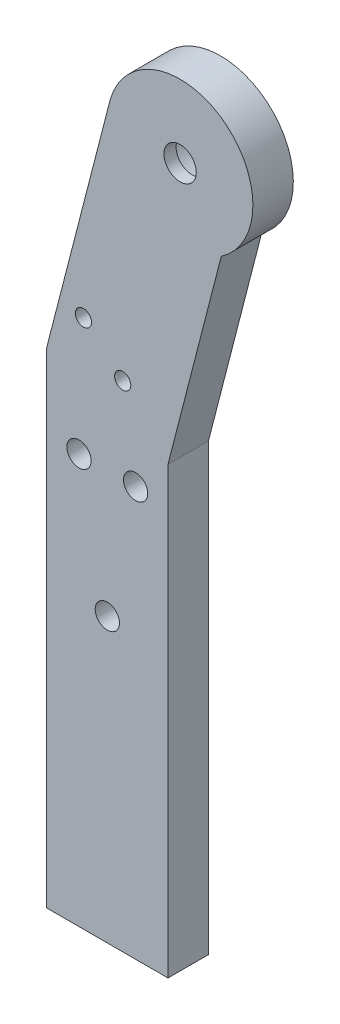
ISO-10303-21;
HEADER;
FILE_DESCRIPTION(('STEP AP214'),'2;1');
FILE_NAME('part.step','',(''),(''),'','','');
FILE_SCHEMA(('AUTOMOTIVE_DESIGN { 1 0 10303 214 1 1 1 1 }'));
ENDSEC;
DATA;
#1=APPLICATION_CONTEXT('core data for automotive mechanical design processes');
#2=APPLICATION_PROTOCOL_DEFINITION('international standard','automotive_design',2000,#1);
#3=PRODUCT_CONTEXT('',#1,'mechanical');
#4=PRODUCT('Part','Part','',(#3));
#5=PRODUCT_RELATED_PRODUCT_CATEGORY('part','',(#4));
#6=PRODUCT_DEFINITION_FORMATION('','',#4);
#7=PRODUCT_DEFINITION_CONTEXT('part definition',#1,'design');
#8=PRODUCT_DEFINITION('design','',#6,#7);
#9=PRODUCT_DEFINITION_SHAPE('','',#8);
#10=(LENGTH_UNIT() NAMED_UNIT(*) SI_UNIT(.MILLI.,.METRE.));
#11=(NAMED_UNIT(*) PLANE_ANGLE_UNIT() SI_UNIT($,.RADIAN.));
#12=(NAMED_UNIT(*) SI_UNIT($,.STERADIAN.) SOLID_ANGLE_UNIT());
#13=UNCERTAINTY_MEASURE_WITH_UNIT(LENGTH_MEASURE(1.E-05),#10,'distance_accuracy_value','');
#14=(GEOMETRIC_REPRESENTATION_CONTEXT(3) GLOBAL_UNCERTAINTY_ASSIGNED_CONTEXT((#13)) GLOBAL_UNIT_ASSIGNED_CONTEXT((#10,
#11,#12)) REPRESENTATION_CONTEXT('',''));
#15=CARTESIAN_POINT('',(0.,0.,0.));
#16=DIRECTION('',(0.,0.,1.));
#17=DIRECTION('',(1.,0.,0.));
#18=AXIS2_PLACEMENT_3D('',#15,#16,#17);
#19=CARTESIAN_POINT('',(10.1625447345755,96.8922983540658,5.));
#20=DIRECTION('',(0.,0.,-1.));
#21=DIRECTION('',(-1.,0.,0.));
#22=AXIS2_PLACEMENT_3D('',#19,#20,#21);
#23=CYLINDRICAL_SURFACE('',#22,2.);
#24=CARTESIAN_POINT('',(10.1625447345755,96.8922983540658,5.));
#25=DIRECTION('',(0.,0.,1.));
#26=DIRECTION('',(1.,0.,0.));
#27=AXIS2_PLACEMENT_3D('',#24,#25,#26);
#28=CIRCLE('',#27,2.);
#29=CARTESIAN_POINT('',(12.1625447345755,96.8922983540658,5.));
#30=VERTEX_POINT('',#29);
#31=EDGE_CURVE('E130',#30,#30,#28,.T.);
#32=ORIENTED_EDGE('',*,*,#31,.T.);
#33=EDGE_LOOP('',(#32));
#34=FACE_BOUND('',#33,.T.);
#35=CARTESIAN_POINT('',(10.1625447345755,96.8922983540658,3.5));
#36=DIRECTION('',(0.,0.,-1.));
#37=DIRECTION('',(-1.,0.,0.));
#38=AXIS2_PLACEMENT_3D('',#35,#36,#37);
#39=CIRCLE('',#38,2.);
#40=CARTESIAN_POINT('',(8.16254473457546,96.8922983540658,3.5));
#41=VERTEX_POINT('',#40);
#42=EDGE_CURVE('E43',#41,#41,#39,.T.);
#43=ORIENTED_EDGE('',*,*,#42,.T.);
#44=EDGE_LOOP('',(#43));
#45=FACE_BOUND('',#44,.T.);
#46=ADVANCED_FACE('F39',(#34,#45),#23,.F.);
#47=CARTESIAN_POINT('',(10.1625447345755,96.8922983540658,5.));
#48=DIRECTION('',(0.,0.,-1.));
#49=DIRECTION('',(-1.,0.,0.));
#50=AXIS2_PLACEMENT_3D('',#47,#48,#49);
#51=PLANE('',#50);
#52=CARTESIAN_POINT('',(-2.33745510636055,59.512300154388,5.));
#53=DIRECTION('',(0.,0.,-1.));
#54=DIRECTION('',(-1.,0.,0.));
#55=AXIS2_PLACEMENT_3D('',#52,#53,#54);
#56=CIRCLE('',#55,1.49999999246271);
#57=CARTESIAN_POINT('',(-3.83745509882326,59.512300154388,5.));
#58=VERTEX_POINT('',#57);
#59=EDGE_CURVE('E257',#58,#58,#56,.T.);
#60=ORIENTED_EDGE('',*,*,#59,.T.);
#61=EDGE_LOOP('',(#60));
#62=FACE_BOUND('',#61,.T.);
#63=CARTESIAN_POINT('',(4.66254492186838,59.512300154388,5.));
#64=DIRECTION('',(0.,0.,-1.));
#65=DIRECTION('',(-1.,0.,0.));
#66=AXIS2_PLACEMENT_3D('',#63,#64,#65);
#67=CIRCLE('',#66,1.49999999246272);
#68=CARTESIAN_POINT('',(3.16254492940565,59.512300154388,5.));
#69=VERTEX_POINT('',#68);
#70=EDGE_CURVE('E260',#69,#69,#67,.T.);
#71=ORIENTED_EDGE('',*,*,#70,.T.);
#72=EDGE_LOOP('',(#71));
#73=FACE_BOUND('',#72,.T.);
#74=CARTESIAN_POINT('',(3.0635978829444,70.0457948561483,5.));
#75=DIRECTION('',(0.,0.,-1.));
#76=DIRECTION('',(-1.,0.,0.));
#77=AXIS2_PLACEMENT_3D('',#74,#75,#76);
#78=CIRCLE('',#77,1.);
#79=CARTESIAN_POINT('',(2.0635978829444,70.0457948561483,5.));
#80=VERTEX_POINT('',#79);
#81=EDGE_CURVE('E205',#80,#80,#78,.T.);
#82=ORIENTED_EDGE('',*,*,#81,.T.);
#83=EDGE_LOOP('',(#82));
#84=FACE_BOUND('',#83,.T.);
#85=CARTESIAN_POINT('',(-1.79494681524586,74.3637276272423,5.));
#86=DIRECTION('',(0.,0.,-1.));
#87=DIRECTION('',(-1.,0.,0.));
#88=AXIS2_PLACEMENT_3D('',#85,#86,#87);
#89=CIRCLE('',#88,1.);
#90=CARTESIAN_POINT('',(-2.79494681524586,74.3637276272423,5.));
#91=VERTEX_POINT('',#90);
#92=EDGE_CURVE('E210',#91,#91,#89,.T.);
#93=ORIENTED_EDGE('',*,*,#92,.T.);
#94=EDGE_LOOP('',(#93));
#95=FACE_BOUND('',#94,.T.);
#96=DIRECTION('',(1.,0.,0.));
#97=VECTOR('',#96,1.);
#98=CARTESIAN_POINT('',(8.66254473457549,8.89229835406582,5.));
#99=LINE('',#98,#97);
#100=CARTESIAN_POINT('',(-6.33745526542453,8.89229835406581,5.));
#101=VERTEX_POINT('',#100);
#102=CARTESIAN_POINT('',(8.66254473457549,8.89229835406582,5.));
#103=VERTEX_POINT('',#102);
#104=EDGE_CURVE('E137',#101,#103,#99,.T.);
#105=ORIENTED_EDGE('',*,*,#104,.T.);
#106=DIRECTION('',(0.,1.,0.));
#107=VECTOR('',#106,1.);
#108=CARTESIAN_POINT('',(8.66254473457547,63.8922983540658,5.));
#109=LINE('',#108,#107);
#110=CARTESIAN_POINT('',(8.66254473457547,63.8922983540658,5.));
#111=VERTEX_POINT('',#110);
#112=EDGE_CURVE('E94',#103,#111,#109,.T.);
#113=ORIENTED_EDGE('',*,*,#112,.T.);
#114=DIRECTION('',(0.24953507523535,0.968365760561209,0.));
#115=VECTOR('',#114,1.);
#116=CARTESIAN_POINT('',(8.66254473457547,63.8922983540658,5.));
#117=LINE('',#116,#115);
#118=CARTESIAN_POINT('',(15.2537740476357,89.4707497230969,5.));
#119=VERTEX_POINT('',#118);
#120=EDGE_CURVE('E108',#111,#119,#117,.T.);
#121=ORIENTED_EDGE('',*,*,#120,.T.);
#122=CARTESIAN_POINT('',(10.1625447345755,96.8922983540658,5.));
#123=DIRECTION('',(0.,0.,1.));
#124=DIRECTION('',(-1.,0.,0.));
#125=AXIS2_PLACEMENT_3D('',#122,#123,#124);
#126=CIRCLE('',#125,9.);
#127=CARTESIAN_POINT('',(1.55603210918578,99.5243964580521,5.));
#128=VERTEX_POINT('',#127);
#129=EDGE_CURVE('E101',#119,#128,#126,.T.);
#130=ORIENTED_EDGE('',*,*,#129,.T.);
#131=DIRECTION('',(-0.24953507523535,-0.968365760561209,0.));
#132=VECTOR('',#131,1.);
#133=CARTESIAN_POINT('',(-6.33745526542453,68.8922983540658,5.));
#134=LINE('',#133,#132);
#135=CARTESIAN_POINT('',(-6.33745526542453,68.8922983540658,5.));
#136=VERTEX_POINT('',#135);
#137=EDGE_CURVE('E106',#128,#136,#134,.T.);
#138=ORIENTED_EDGE('',*,*,#137,.T.);
#139=DIRECTION('',(0.,-1.,0.));
#140=VECTOR('',#139,1.);
#141=CARTESIAN_POINT('',(-6.33745526542453,8.89229835406581,5.));
#142=LINE('',#141,#140);
#143=EDGE_CURVE('E57',#136,#101,#142,.T.);
#144=ORIENTED_EDGE('',*,*,#143,.T.);
#145=EDGE_LOOP('',(#105,#113,#121,#130,#138,#144));
#146=FACE_BOUND('',#145,.T.);
#147=ORIENTED_EDGE('',*,*,#31,.F.);
#148=EDGE_LOOP('',(#147));
#149=FACE_BOUND('',#148,.T.);
#150=CARTESIAN_POINT('',(1.16254473457547,43.8922983540658,5.));
#151=DIRECTION('',(0.,0.,1.));
#152=DIRECTION('',(1.,0.,0.));
#153=AXIS2_PLACEMENT_3D('',#150,#151,#152);
#154=CIRCLE('',#153,1.5);
#155=CARTESIAN_POINT('',(2.66254473457547,43.8922983540658,5.));
#156=VERTEX_POINT('',#155);
#157=EDGE_CURVE('E213',#156,#156,#154,.T.);
#158=ORIENTED_EDGE('',*,*,#157,.F.);
#159=EDGE_LOOP('',(#158));
#160=FACE_BOUND('',#159,.T.);
#161=ADVANCED_FACE('F103',(#62,#73,#84,#95,#146,#149,#160),#51,.F.);
#162=CARTESIAN_POINT('',(10.1625447345755,96.8922983540658,0.));
#163=DIRECTION('',(0.,0.,-1.));
#164=DIRECTION('',(-1.,0.,0.));
#165=AXIS2_PLACEMENT_3D('',#162,#163,#164);
#166=PLANE('',#165);
#167=CARTESIAN_POINT('',(-2.33745510636055,59.512300154388,0.));
#168=DIRECTION('',(0.,0.,-1.));
#169=DIRECTION('',(-1.,0.,0.));
#170=AXIS2_PLACEMENT_3D('',#167,#168,#169);
#171=CIRCLE('',#170,1.49999999246271);
#172=CARTESIAN_POINT('',(-3.83745509882326,59.512300154388,0.));
#173=VERTEX_POINT('',#172);
#174=EDGE_CURVE('E187',#173,#173,#171,.T.);
#175=ORIENTED_EDGE('',*,*,#174,.F.);
#176=EDGE_LOOP('',(#175));
#177=FACE_BOUND('',#176,.T.);
#178=CARTESIAN_POINT('',(4.66254492186838,59.512300154388,0.));
#179=DIRECTION('',(0.,0.,-1.));
#180=DIRECTION('',(-1.,0.,0.));
#181=AXIS2_PLACEMENT_3D('',#178,#179,#180);
#182=CIRCLE('',#181,1.49999999246272);
#183=CARTESIAN_POINT('',(3.16254492940565,59.512300154388,0.));
#184=VERTEX_POINT('',#183);
#185=EDGE_CURVE('E191',#184,#184,#182,.T.);
#186=ORIENTED_EDGE('',*,*,#185,.F.);
#187=EDGE_LOOP('',(#186));
#188=FACE_BOUND('',#187,.T.);
#189=CARTESIAN_POINT('',(3.0635978829444,70.0457948561483,0.));
#190=DIRECTION('',(0.,0.,-1.));
#191=DIRECTION('',(-1.,0.,0.));
#192=AXIS2_PLACEMENT_3D('',#189,#190,#191);
#193=CIRCLE('',#192,1.);
#194=CARTESIAN_POINT('',(2.0635978829444,70.0457948561483,0.));
#195=VERTEX_POINT('',#194);
#196=EDGE_CURVE('E195',#195,#195,#193,.T.);
#197=ORIENTED_EDGE('',*,*,#196,.F.);
#198=EDGE_LOOP('',(#197));
#199=FACE_BOUND('',#198,.T.);
#200=CARTESIAN_POINT('',(-1.79494681524586,74.3637276272423,0.));
#201=DIRECTION('',(0.,0.,-1.));
#202=DIRECTION('',(-1.,0.,0.));
#203=AXIS2_PLACEMENT_3D('',#200,#201,#202);
#204=CIRCLE('',#203,1.);
#205=CARTESIAN_POINT('',(-2.79494681524586,74.3637276272423,0.));
#206=VERTEX_POINT('',#205);
#207=EDGE_CURVE('E199',#206,#206,#204,.T.);
#208=ORIENTED_EDGE('',*,*,#207,.F.);
#209=EDGE_LOOP('',(#208));
#210=FACE_BOUND('',#209,.T.);
#211=CARTESIAN_POINT('',(10.1625447345755,96.8922983540658,0.));
#212=DIRECTION('',(0.,0.,-1.));
#213=DIRECTION('',(-1.,0.,0.));
#214=AXIS2_PLACEMENT_3D('',#211,#212,#213);
#215=CIRCLE('',#214,4.5);
#216=CARTESIAN_POINT('',(5.66254473457546,96.8922983540658,0.));
#217=VERTEX_POINT('',#216);
#218=EDGE_CURVE('E202',#217,#217,#215,.T.);
#219=ORIENTED_EDGE('',*,*,#218,.F.);
#220=EDGE_LOOP('',(#219));
#221=FACE_BOUND('',#220,.T.);
#222=DIRECTION('',(1.,0.,0.));
#223=VECTOR('',#222,1.);
#224=CARTESIAN_POINT('',(8.66254473457549,8.89229835406582,0.));
#225=LINE('',#224,#223);
#226=CARTESIAN_POINT('',(-6.33745526542453,8.89229835406581,0.));
#227=VERTEX_POINT('',#226);
#228=CARTESIAN_POINT('',(8.66254473457549,8.89229835406582,0.));
#229=VERTEX_POINT('',#228);
#230=EDGE_CURVE('E126',#227,#229,#225,.T.);
#231=ORIENTED_EDGE('',*,*,#230,.F.);
#232=DIRECTION('',(0.,-1.,0.));
#233=VECTOR('',#232,1.);
#234=CARTESIAN_POINT('',(-6.33745526542453,8.89229835406581,0.));
#235=LINE('',#234,#233);
#236=CARTESIAN_POINT('',(-6.33745526542453,68.8922983540658,0.));
#237=VERTEX_POINT('',#236);
#238=EDGE_CURVE('E86',#237,#227,#235,.T.);
#239=ORIENTED_EDGE('',*,*,#238,.F.);
#240=DIRECTION('',(-0.24953507523535,-0.968365760561209,0.));
#241=VECTOR('',#240,1.);
#242=CARTESIAN_POINT('',(-6.33745526542453,68.8922983540658,0.));
#243=LINE('',#242,#241);
#244=CARTESIAN_POINT('',(1.55603210918578,99.5243964580521,0.));
#245=VERTEX_POINT('',#244);
#246=EDGE_CURVE('E80',#245,#237,#243,.T.);
#247=ORIENTED_EDGE('',*,*,#246,.F.);
#248=CARTESIAN_POINT('',(10.1625447345755,96.8922983540658,0.));
#249=DIRECTION('',(0.,0.,1.));
#250=DIRECTION('',(-1.,0.,0.));
#251=AXIS2_PLACEMENT_3D('',#248,#249,#250);
#252=CIRCLE('',#251,9.);
#253=CARTESIAN_POINT('',(15.2537740476357,89.4707497230969,0.));
#254=VERTEX_POINT('',#253);
#255=EDGE_CURVE('E116',#254,#245,#252,.T.);
#256=ORIENTED_EDGE('',*,*,#255,.F.);
#257=DIRECTION('',(0.24953507523535,0.968365760561209,0.));
#258=VECTOR('',#257,1.);
#259=CARTESIAN_POINT('',(8.66254473457547,63.8922983540658,0.));
#260=LINE('',#259,#258);
#261=CARTESIAN_POINT('',(8.66254473457547,63.8922983540658,0.));
#262=VERTEX_POINT('',#261);
#263=EDGE_CURVE('E132',#262,#254,#260,.T.);
#264=ORIENTED_EDGE('',*,*,#263,.F.);
#265=DIRECTION('',(0.,1.,0.));
#266=VECTOR('',#265,1.);
#267=CARTESIAN_POINT('',(8.66254473457547,63.8922983540658,0.));
#268=LINE('',#267,#266);
#269=EDGE_CURVE('E129',#229,#262,#268,.T.);
#270=ORIENTED_EDGE('',*,*,#269,.F.);
#271=EDGE_LOOP('',(#231,#239,#247,#256,#264,#270));
#272=FACE_BOUND('',#271,.T.);
#273=CARTESIAN_POINT('',(1.16254473457547,43.8922983540658,0.));
#274=DIRECTION('',(0.,0.,1.));
#275=DIRECTION('',(1.,0.,0.));
#276=AXIS2_PLACEMENT_3D('',#273,#274,#275);
#277=CIRCLE('',#276,1.5);
#278=CARTESIAN_POINT('',(2.66254473457547,43.8922983540658,0.));
#279=VERTEX_POINT('',#278);
#280=EDGE_CURVE('E216',#279,#279,#277,.T.);
#281=ORIENTED_EDGE('',*,*,#280,.T.);
#282=EDGE_LOOP('',(#281));
#283=FACE_BOUND('',#282,.T.);
#284=ADVANCED_FACE('F147',(#177,#188,#199,#210,#221,#272,#283),#166,.T.);
#285=CARTESIAN_POINT('',(8.66254473457549,8.89229835406582,5.));
#286=DIRECTION('',(0.,1.,0.));
#287=DIRECTION('',(-1.,0.,0.));
#288=AXIS2_PLACEMENT_3D('',#285,#286,#287);
#289=PLANE('',#288);
#290=ORIENTED_EDGE('',*,*,#230,.T.);
#291=DIRECTION('',(0.,0.,-1.));
#292=VECTOR('',#291,1.);
#293=CARTESIAN_POINT('',(8.66254473457549,8.89229835406582,5.));
#294=LINE('',#293,#292);
#295=EDGE_CURVE('E11',#103,#229,#294,.T.);
#296=ORIENTED_EDGE('',*,*,#295,.F.);
#297=ORIENTED_EDGE('',*,*,#104,.F.);
#298=DIRECTION('',(0.,0.,-1.));
#299=VECTOR('',#298,1.);
#300=CARTESIAN_POINT('',(-6.33745526542453,8.89229835406581,5.));
#301=LINE('',#300,#299);
#302=EDGE_CURVE('E122',#101,#227,#301,.T.);
#303=ORIENTED_EDGE('',*,*,#302,.T.);
#304=EDGE_LOOP('',(#290,#296,#297,#303));
#305=FACE_BOUND('',#304,.T.);
#306=ADVANCED_FACE('F41',(#305),#289,.F.);
#307=CARTESIAN_POINT('',(8.66254473457547,63.8922983540658,5.));
#308=DIRECTION('',(-1.,0.,0.));
#309=DIRECTION('',(0.,-1.,0.));
#310=AXIS2_PLACEMENT_3D('',#307,#308,#309);
#311=PLANE('',#310);
#312=ORIENTED_EDGE('',*,*,#269,.T.);
#313=DIRECTION('',(0.,0.,-1.));
#314=VECTOR('',#313,1.);
#315=CARTESIAN_POINT('',(8.66254473457547,63.8922983540658,5.));
#316=LINE('',#315,#314);
#317=EDGE_CURVE('E49',#111,#262,#316,.T.);
#318=ORIENTED_EDGE('',*,*,#317,.F.);
#319=ORIENTED_EDGE('',*,*,#112,.F.);
#320=ORIENTED_EDGE('',*,*,#295,.T.);
#321=EDGE_LOOP('',(#312,#318,#319,#320));
#322=FACE_BOUND('',#321,.T.);
#323=ADVANCED_FACE('F183',(#322),#311,.F.);
#324=CARTESIAN_POINT('',(8.66254473457547,63.8922983540658,5.));
#325=DIRECTION('',(-0.968365760561209,0.24953507523535,0.));
#326=DIRECTION('',(-0.24953507523535,-0.968365760561209,0.));
#327=AXIS2_PLACEMENT_3D('',#324,#325,#326);
#328=PLANE('',#327);
#329=ORIENTED_EDGE('',*,*,#263,.T.);
#330=DIRECTION('',(0.,0.,-1.));
#331=VECTOR('',#330,1.);
#332=CARTESIAN_POINT('',(15.2537740476357,89.4707497230969,5.));
#333=LINE('',#332,#331);
#334=EDGE_CURVE('E117',#119,#254,#333,.T.);
#335=ORIENTED_EDGE('',*,*,#334,.F.);
#336=ORIENTED_EDGE('',*,*,#120,.F.);
#337=ORIENTED_EDGE('',*,*,#317,.T.);
#338=EDGE_LOOP('',(#329,#335,#336,#337));
#339=FACE_BOUND('',#338,.T.);
#340=ADVANCED_FACE('F144',(#339),#328,.F.);
#341=CARTESIAN_POINT('',(10.1625447345755,96.8922983540658,5.));
#342=DIRECTION('',(0.,0.,-1.));
#343=DIRECTION('',(-1.,0.,0.));
#344=AXIS2_PLACEMENT_3D('',#341,#342,#343);
#345=CYLINDRICAL_SURFACE('',#344,9.);
#346=ORIENTED_EDGE('',*,*,#255,.T.);
#347=DIRECTION('',(0.,0.,-1.));
#348=VECTOR('',#347,1.);
#349=CARTESIAN_POINT('',(1.55603210918578,99.5243964580521,5.));
#350=LINE('',#349,#348);
#351=EDGE_CURVE('E113',#128,#245,#350,.T.);
#352=ORIENTED_EDGE('',*,*,#351,.F.);
#353=ORIENTED_EDGE('',*,*,#129,.F.);
#354=ORIENTED_EDGE('',*,*,#334,.T.);
#355=EDGE_LOOP('',(#346,#352,#353,#354));
#356=FACE_BOUND('',#355,.T.);
#357=ADVANCED_FACE('F114',(#356),#345,.T.);
#358=CARTESIAN_POINT('',(-6.33745526542453,68.8922983540658,5.));
#359=DIRECTION('',(0.968365760561209,-0.24953507523535,0.));
#360=DIRECTION('',(0.24953507523535,0.968365760561209,0.));
#361=AXIS2_PLACEMENT_3D('',#358,#359,#360);
#362=PLANE('',#361);
#363=ORIENTED_EDGE('',*,*,#246,.T.);
#364=DIRECTION('',(0.,0.,-1.));
#365=VECTOR('',#364,1.);
#366=CARTESIAN_POINT('',(-6.33745526542453,68.8922983540658,5.));
#367=LINE('',#366,#365);
#368=EDGE_CURVE('E118',#136,#237,#367,.T.);
#369=ORIENTED_EDGE('',*,*,#368,.F.);
#370=ORIENTED_EDGE('',*,*,#137,.F.);
#371=ORIENTED_EDGE('',*,*,#351,.T.);
#372=EDGE_LOOP('',(#363,#369,#370,#371));
#373=FACE_BOUND('',#372,.T.);
#374=ADVANCED_FACE('F120',(#373),#362,.F.);
#375=CARTESIAN_POINT('',(-6.33745526542453,8.89229835406581,5.));
#376=DIRECTION('',(1.,0.,0.));
#377=DIRECTION('',(0.,0.,-1.));
#378=AXIS2_PLACEMENT_3D('',#375,#376,#377);
#379=PLANE('',#378);
#380=ORIENTED_EDGE('',*,*,#238,.T.);
#381=ORIENTED_EDGE('',*,*,#302,.F.);
#382=ORIENTED_EDGE('',*,*,#143,.F.);
#383=ORIENTED_EDGE('',*,*,#368,.T.);
#384=EDGE_LOOP('',(#380,#381,#382,#383));
#385=FACE_BOUND('',#384,.T.);
#386=ADVANCED_FACE('F152',(#385),#379,.F.);
#387=CARTESIAN_POINT('',(1.16254473457547,43.8922983540658,5.));
#388=DIRECTION('',(0.,0.,-1.));
#389=DIRECTION('',(-1.,0.,0.));
#390=AXIS2_PLACEMENT_3D('',#387,#388,#389);
#391=CYLINDRICAL_SURFACE('',#390,1.5);
#392=ORIENTED_EDGE('',*,*,#157,.T.);
#393=EDGE_LOOP('',(#392));
#394=FACE_BOUND('',#393,.T.);
#395=ORIENTED_EDGE('',*,*,#280,.F.);
#396=EDGE_LOOP('',(#395));
#397=FACE_BOUND('',#396,.T.);
#398=ADVANCED_FACE('F154',(#394,#397),#391,.F.);
#399=CARTESIAN_POINT('',(10.1625447345755,96.8922983540658,3.5));
#400=DIRECTION('',(0.,0.,-1.));
#401=DIRECTION('',(-1.,0.,0.));
#402=AXIS2_PLACEMENT_3D('',#399,#400,#401);
#403=CYLINDRICAL_SURFACE('',#402,4.5);
#404=CARTESIAN_POINT('',(10.1625447345755,96.8922983540658,3.5));
#405=DIRECTION('',(0.,0.,-1.));
#406=DIRECTION('',(-1.,0.,0.));
#407=AXIS2_PLACEMENT_3D('',#404,#405,#406);
#408=CIRCLE('',#407,4.5);
#409=CARTESIAN_POINT('',(5.66254473457546,96.8922983540658,3.5));
#410=VERTEX_POINT('',#409);
#411=EDGE_CURVE('E204',#410,#410,#408,.T.);
#412=ORIENTED_EDGE('',*,*,#411,.F.);
#413=EDGE_LOOP('',(#412));
#414=FACE_BOUND('',#413,.T.);
#415=ORIENTED_EDGE('',*,*,#218,.T.);
#416=EDGE_LOOP('',(#415));
#417=FACE_BOUND('',#416,.T.);
#418=ADVANCED_FACE('F160',(#414,#417),#403,.F.);
#419=CARTESIAN_POINT('',(10.1625447345755,96.8922983540658,3.5));
#420=DIRECTION('',(0.,0.,-1.));
#421=DIRECTION('',(-1.,0.,0.));
#422=AXIS2_PLACEMENT_3D('',#419,#420,#421);
#423=PLANE('',#422);
#424=ORIENTED_EDGE('',*,*,#42,.F.);
#425=EDGE_LOOP('',(#424));
#426=FACE_BOUND('',#425,.T.);
#427=ORIENTED_EDGE('',*,*,#411,.T.);
#428=EDGE_LOOP('',(#427));
#429=FACE_BOUND('',#428,.T.);
#430=ADVANCED_FACE('F229',(#426,#429),#423,.T.);
#431=CARTESIAN_POINT('',(-1.79494681524586,74.3637276272423,10.));
#432=DIRECTION('',(0.,0.,-1.));
#433=DIRECTION('',(-1.,0.,0.));
#434=AXIS2_PLACEMENT_3D('',#431,#432,#433);
#435=CYLINDRICAL_SURFACE('',#434,1.);
#436=ORIENTED_EDGE('',*,*,#207,.T.);
#437=EDGE_LOOP('',(#436));
#438=FACE_BOUND('',#437,.T.);
#439=ORIENTED_EDGE('',*,*,#92,.F.);
#440=EDGE_LOOP('',(#439));
#441=FACE_BOUND('',#440,.T.);
#442=ADVANCED_FACE('F232',(#438,#441),#435,.F.);
#443=CARTESIAN_POINT('',(3.0635978829444,70.0457948561483,10.));
#444=DIRECTION('',(0.,0.,-1.));
#445=DIRECTION('',(-1.,0.,0.));
#446=AXIS2_PLACEMENT_3D('',#443,#444,#445);
#447=CYLINDRICAL_SURFACE('',#446,1.);
#448=ORIENTED_EDGE('',*,*,#196,.T.);
#449=EDGE_LOOP('',(#448));
#450=FACE_BOUND('',#449,.T.);
#451=ORIENTED_EDGE('',*,*,#81,.F.);
#452=EDGE_LOOP('',(#451));
#453=FACE_BOUND('',#452,.T.);
#454=ADVANCED_FACE('F241',(#450,#453),#447,.F.);
#455=CARTESIAN_POINT('',(4.66254492186838,59.512300154388,5.));
#456=DIRECTION('',(0.,0.,-1.));
#457=DIRECTION('',(-1.,0.,0.));
#458=AXIS2_PLACEMENT_3D('',#455,#456,#457);
#459=CYLINDRICAL_SURFACE('',#458,1.49999999246272);
#460=ORIENTED_EDGE('',*,*,#70,.F.);
#461=EDGE_LOOP('',(#460));
#462=FACE_BOUND('',#461,.T.);
#463=ORIENTED_EDGE('',*,*,#185,.T.);
#464=EDGE_LOOP('',(#463));
#465=FACE_BOUND('',#464,.T.);
#466=ADVANCED_FACE('F245',(#462,#465),#459,.F.);
#467=CARTESIAN_POINT('',(-2.33745510636055,59.512300154388,5.));
#468=DIRECTION('',(0.,0.,-1.));
#469=DIRECTION('',(-1.,0.,0.));
#470=AXIS2_PLACEMENT_3D('',#467,#468,#469);
#471=CYLINDRICAL_SURFACE('',#470,1.49999999246271);
#472=ORIENTED_EDGE('',*,*,#59,.F.);
#473=EDGE_LOOP('',(#472));
#474=FACE_BOUND('',#473,.T.);
#475=ORIENTED_EDGE('',*,*,#174,.T.);
#476=EDGE_LOOP('',(#475));
#477=FACE_BOUND('',#476,.T.);
#478=ADVANCED_FACE('F248',(#474,#477),#471,.F.);
#479=CLOSED_SHELL('',(#46,#161,#284,#306,#323,#340,#357,#374,#386,#398,#418,#430,#442,#454,#466,#478));
#480=MANIFOLD_SOLID_BREP('B2',#479);
#481=ADVANCED_BREP_SHAPE_REPRESENTATION('',(#18,#480),#14);
#482=SHAPE_DEFINITION_REPRESENTATION(#9,#481);
ENDSEC;
END-ISO-10303-21;
